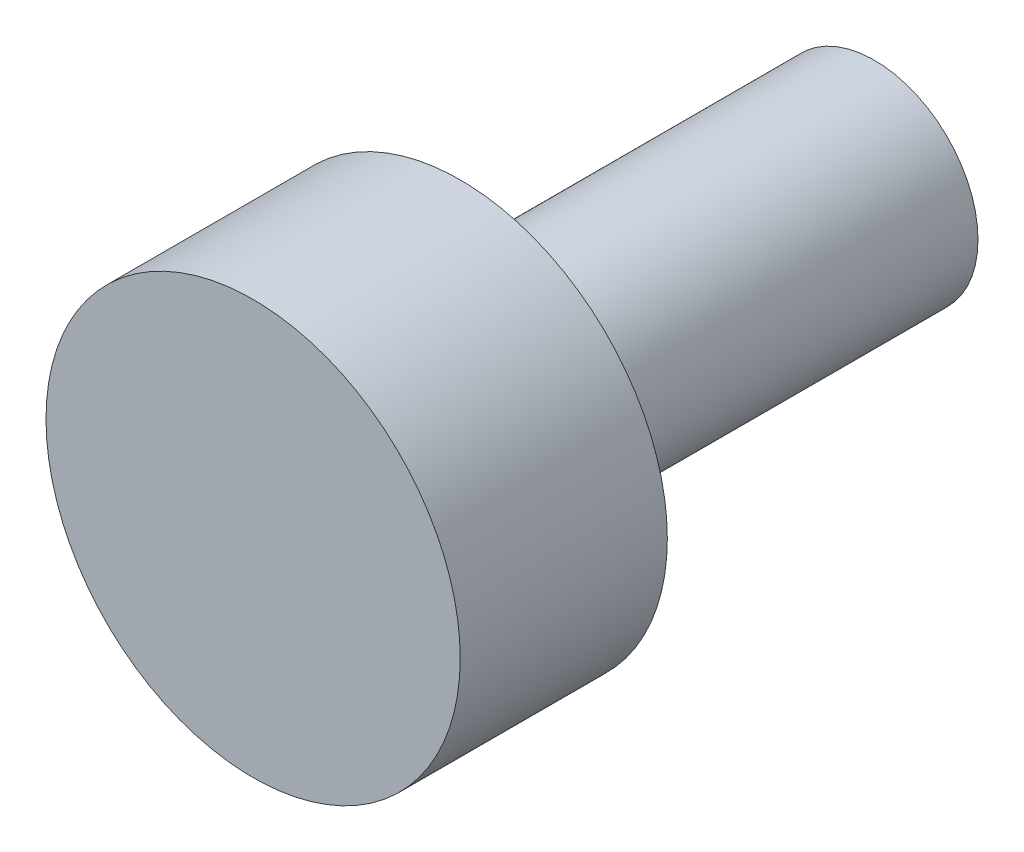
ISO-10303-21;
HEADER;
FILE_DESCRIPTION(('STEP AP214'),'2;1');
FILE_NAME('part.step','',(''),(''),'','','');
FILE_SCHEMA(('AUTOMOTIVE_DESIGN { 1 0 10303 214 1 1 1 1 }'));
ENDSEC;
DATA;
#1=APPLICATION_CONTEXT('core data for automotive mechanical design processes');
#2=APPLICATION_PROTOCOL_DEFINITION('international standard','automotive_design',2000,#1);
#3=PRODUCT_CONTEXT('',#1,'mechanical');
#4=PRODUCT('Part','Part','',(#3));
#5=PRODUCT_RELATED_PRODUCT_CATEGORY('part','',(#4));
#6=PRODUCT_DEFINITION_FORMATION('','',#4);
#7=PRODUCT_DEFINITION_CONTEXT('part definition',#1,'design');
#8=PRODUCT_DEFINITION('design','',#6,#7);
#9=PRODUCT_DEFINITION_SHAPE('','',#8);
#10=(LENGTH_UNIT() NAMED_UNIT(*) SI_UNIT(.MILLI.,.METRE.));
#11=(NAMED_UNIT(*) PLANE_ANGLE_UNIT() SI_UNIT($,.RADIAN.));
#12=(NAMED_UNIT(*) SI_UNIT($,.STERADIAN.) SOLID_ANGLE_UNIT());
#13=UNCERTAINTY_MEASURE_WITH_UNIT(LENGTH_MEASURE(1.E-05),#10,'distance_accuracy_value','');
#14=(GEOMETRIC_REPRESENTATION_CONTEXT(3) GLOBAL_UNCERTAINTY_ASSIGNED_CONTEXT((#13)) GLOBAL_UNIT_ASSIGNED_CONTEXT((#10,
#11,#12)) REPRESENTATION_CONTEXT('',''));
#15=CARTESIAN_POINT('',(0.,0.,0.));
#16=DIRECTION('',(0.,0.,1.));
#17=DIRECTION('',(1.,0.,0.));
#18=AXIS2_PLACEMENT_3D('',#15,#16,#17);
#19=CARTESIAN_POINT('',(0.,0.,25.4));
#20=DIRECTION('',(0.,0.,-1.));
#21=DIRECTION('',(-1.,0.,0.));
#22=AXIS2_PLACEMENT_3D('',#19,#20,#21);
#23=CYLINDRICAL_SURFACE('',#22,25.4);
#24=CARTESIAN_POINT('',(0.,0.,25.4));
#25=DIRECTION('',(0.,0.,1.));
#26=DIRECTION('',(1.,0.,0.));
#27=AXIS2_PLACEMENT_3D('',#24,#25,#26);
#28=CIRCLE('',#27,25.4);
#29=CARTESIAN_POINT('',(25.4,0.,25.4));
#30=VERTEX_POINT('',#29);
#31=EDGE_CURVE('E10',#30,#30,#28,.T.);
#32=ORIENTED_EDGE('',*,*,#31,.F.);
#33=EDGE_LOOP('',(#32));
#34=FACE_BOUND('',#33,.T.);
#35=CARTESIAN_POINT('',(0.,0.,0.));
#36=DIRECTION('',(0.,0.,1.));
#37=DIRECTION('',(1.,0.,0.));
#38=AXIS2_PLACEMENT_3D('',#35,#36,#37);
#39=CIRCLE('',#38,25.4);
#40=CARTESIAN_POINT('',(25.4,0.,0.));
#41=VERTEX_POINT('',#40);
#42=EDGE_CURVE('E40',#41,#41,#39,.T.);
#43=ORIENTED_EDGE('',*,*,#42,.T.);
#44=EDGE_LOOP('',(#43));
#45=FACE_BOUND('',#44,.T.);
#46=ADVANCED_FACE('F37',(#34,#45),#23,.T.);
#47=CARTESIAN_POINT('',(0.,0.,25.4));
#48=DIRECTION('',(0.,0.,1.));
#49=DIRECTION('',(1.,0.,0.));
#50=AXIS2_PLACEMENT_3D('',#47,#48,#49);
#51=PLANE('',#50);
#52=ORIENTED_EDGE('',*,*,#31,.T.);
#53=EDGE_LOOP('',(#52));
#54=FACE_BOUND('',#53,.T.);
#55=ADVANCED_FACE('F71',(#54),#51,.T.);
#56=CARTESIAN_POINT('',(0.,0.,0.));
#57=DIRECTION('',(0.,0.,1.));
#58=DIRECTION('',(1.,0.,0.));
#59=AXIS2_PLACEMENT_3D('',#56,#57,#58);
#60=PLANE('',#59);
#61=CARTESIAN_POINT('',(0.,0.,0.));
#62=DIRECTION('',(0.,0.,1.));
#63=DIRECTION('',(1.,0.,0.));
#64=AXIS2_PLACEMENT_3D('',#61,#62,#63);
#65=CIRCLE('',#64,12.7);
#66=CARTESIAN_POINT('',(12.7,0.,0.));
#67=VERTEX_POINT('',#66);
#68=EDGE_CURVE('E51',#67,#67,#65,.T.);
#69=ORIENTED_EDGE('',*,*,#68,.T.);
#70=EDGE_LOOP('',(#69));
#71=FACE_BOUND('',#70,.T.);
#72=ORIENTED_EDGE('',*,*,#42,.F.);
#73=EDGE_LOOP('',(#72));
#74=FACE_BOUND('',#73,.T.);
#75=ADVANCED_FACE('F68',(#71,#74),#60,.F.);
#76=CARTESIAN_POINT('',(0.,0.,-50.8));
#77=DIRECTION('',(0.,0.,1.));
#78=DIRECTION('',(1.,0.,0.));
#79=AXIS2_PLACEMENT_3D('',#76,#77,#78);
#80=CYLINDRICAL_SURFACE('',#79,12.7);
#81=CARTESIAN_POINT('',(0.,0.,-50.8));
#82=DIRECTION('',(0.,0.,1.));
#83=DIRECTION('',(1.,0.,0.));
#84=AXIS2_PLACEMENT_3D('',#81,#82,#83);
#85=CIRCLE('',#84,12.7);
#86=CARTESIAN_POINT('',(12.7,0.,-50.8));
#87=VERTEX_POINT('',#86);
#88=EDGE_CURVE('E49',#87,#87,#85,.T.);
#89=ORIENTED_EDGE('',*,*,#88,.T.);
#90=EDGE_LOOP('',(#89));
#91=FACE_BOUND('',#90,.T.);
#92=ORIENTED_EDGE('',*,*,#68,.F.);
#93=EDGE_LOOP('',(#92));
#94=FACE_BOUND('',#93,.T.);
#95=ADVANCED_FACE('F59',(#91,#94),#80,.T.);
#96=CARTESIAN_POINT('',(0.,0.,-50.8));
#97=DIRECTION('',(0.,0.,1.));
#98=DIRECTION('',(1.,0.,0.));
#99=AXIS2_PLACEMENT_3D('',#96,#97,#98);
#100=PLANE('',#99);
#101=ORIENTED_EDGE('',*,*,#88,.F.);
#102=EDGE_LOOP('',(#101));
#103=FACE_BOUND('',#102,.T.);
#104=ADVANCED_FACE('F62',(#103),#100,.F.);
#105=CLOSED_SHELL('',(#46,#55,#75,#95,#104));
#106=MANIFOLD_SOLID_BREP('B2',#105);
#107=ADVANCED_BREP_SHAPE_REPRESENTATION('',(#18,#106),#14);
#108=SHAPE_DEFINITION_REPRESENTATION(#9,#107);
ENDSEC;
END-ISO-10303-21;
